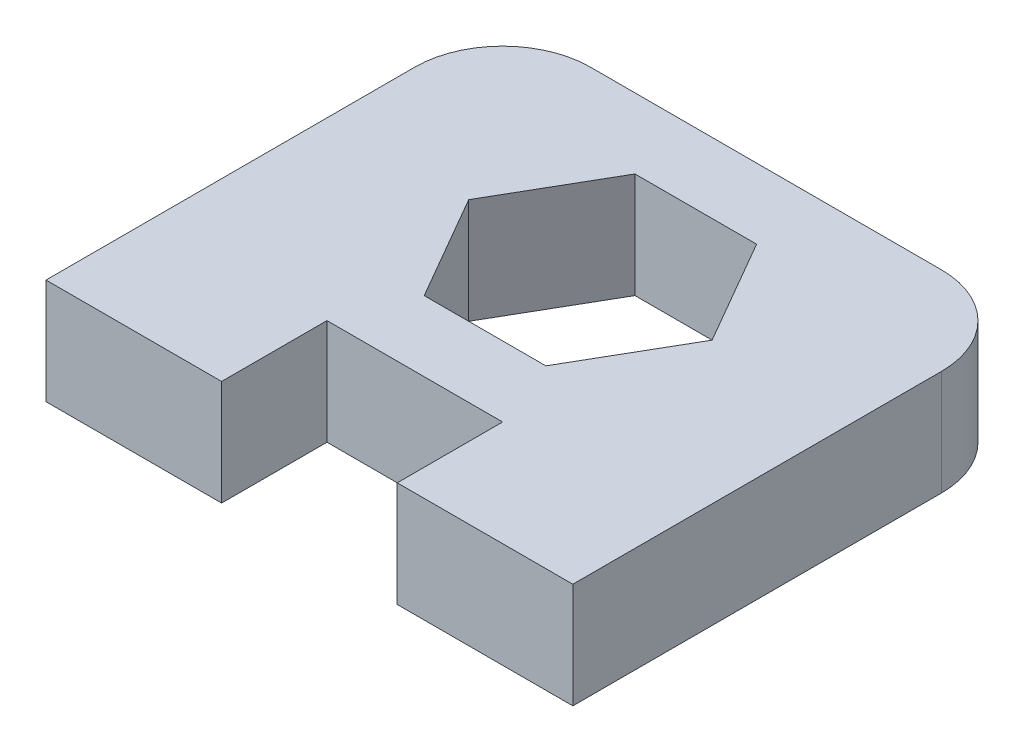
ISO-10303-21;
HEADER;
FILE_DESCRIPTION(('STEP AP214'),'2;1');
FILE_NAME('part.step','',(''),(''),'','','');
FILE_SCHEMA(('AUTOMOTIVE_DESIGN { 1 0 10303 214 1 1 1 1 }'));
ENDSEC;
DATA;
#1=APPLICATION_CONTEXT('core data for automotive mechanical design processes');
#2=APPLICATION_PROTOCOL_DEFINITION('international standard','automotive_design',2000,#1);
#3=PRODUCT_CONTEXT('',#1,'mechanical');
#4=PRODUCT('Part','Part','',(#3));
#5=PRODUCT_RELATED_PRODUCT_CATEGORY('part','',(#4));
#6=PRODUCT_DEFINITION_FORMATION('','',#4);
#7=PRODUCT_DEFINITION_CONTEXT('part definition',#1,'design');
#8=PRODUCT_DEFINITION('design','',#6,#7);
#9=PRODUCT_DEFINITION_SHAPE('','',#8);
#10=(LENGTH_UNIT() NAMED_UNIT(*) SI_UNIT(.MILLI.,.METRE.));
#11=(NAMED_UNIT(*) PLANE_ANGLE_UNIT() SI_UNIT($,.RADIAN.));
#12=(NAMED_UNIT(*) SI_UNIT($,.STERADIAN.) SOLID_ANGLE_UNIT());
#13=UNCERTAINTY_MEASURE_WITH_UNIT(LENGTH_MEASURE(1.E-05),#10,'distance_accuracy_value','');
#14=(GEOMETRIC_REPRESENTATION_CONTEXT(3) GLOBAL_UNCERTAINTY_ASSIGNED_CONTEXT((#13)) GLOBAL_UNIT_ASSIGNED_CONTEXT((#10,
#11,#12)) REPRESENTATION_CONTEXT('',''));
#15=CARTESIAN_POINT('',(0.,0.,0.));
#16=DIRECTION('',(0.,0.,1.));
#17=DIRECTION('',(1.,0.,0.));
#18=AXIS2_PLACEMENT_3D('',#15,#16,#17);
#19=CARTESIAN_POINT('',(2.5,3.,-10.5));
#20=DIRECTION('',(0.,-1.,0.));
#21=DIRECTION('',(0.,0.,-1.));
#22=AXIS2_PLACEMENT_3D('',#19,#20,#21);
#23=PLANE('',#22);
#24=DIRECTION('',(1.,0.,0.));
#25=VECTOR('',#24,1.);
#26=CARTESIAN_POINT('',(5.,3.,0.));
#27=LINE('',#26,#25);
#28=CARTESIAN_POINT('',(0.,3.,0.));
#29=VERTEX_POINT('',#28);
#30=CARTESIAN_POINT('',(5.,3.,0.));
#31=VERTEX_POINT('',#30);
#32=EDGE_CURVE('E197',#29,#31,#27,.T.);
#33=ORIENTED_EDGE('',*,*,#32,.T.);
#34=DIRECTION('',(0.,0.,-1.));
#35=VECTOR('',#34,1.);
#36=CARTESIAN_POINT('',(5.,3.,-3.));
#37=LINE('',#36,#35);
#38=CARTESIAN_POINT('',(5.,3.,-3.));
#39=VERTEX_POINT('',#38);
#40=EDGE_CURVE('E200',#31,#39,#37,.T.);
#41=ORIENTED_EDGE('',*,*,#40,.T.);
#42=DIRECTION('',(1.,0.,0.));
#43=VECTOR('',#42,1.);
#44=CARTESIAN_POINT('',(10.,3.,-3.));
#45=LINE('',#44,#43);
#46=CARTESIAN_POINT('',(10.,3.,-3.));
#47=VERTEX_POINT('',#46);
#48=EDGE_CURVE('E203',#39,#47,#45,.T.);
#49=ORIENTED_EDGE('',*,*,#48,.T.);
#50=DIRECTION('',(0.,0.,1.));
#51=VECTOR('',#50,1.);
#52=CARTESIAN_POINT('',(10.,3.,0.));
#53=LINE('',#52,#51);
#54=CARTESIAN_POINT('',(10.,3.,0.));
#55=VERTEX_POINT('',#54);
#56=EDGE_CURVE('E205',#47,#55,#53,.T.);
#57=ORIENTED_EDGE('',*,*,#56,.T.);
#58=DIRECTION('',(1.,0.,0.));
#59=VECTOR('',#58,1.);
#60=CARTESIAN_POINT('',(15.,3.,0.));
#61=LINE('',#60,#59);
#62=CARTESIAN_POINT('',(15.,3.,0.));
#63=VERTEX_POINT('',#62);
#64=EDGE_CURVE('E207',#55,#63,#61,.T.);
#65=ORIENTED_EDGE('',*,*,#64,.T.);
#66=DIRECTION('',(0.,0.,-1.));
#67=VECTOR('',#66,1.);
#68=CARTESIAN_POINT('',(15.,3.,-10.5));
#69=LINE('',#68,#67);
#70=CARTESIAN_POINT('',(15.,3.,-10.5));
#71=VERTEX_POINT('',#70);
#72=EDGE_CURVE('E209',#63,#71,#69,.T.);
#73=ORIENTED_EDGE('',*,*,#72,.T.);
#74=CARTESIAN_POINT('',(12.5,3.,-10.5));
#75=DIRECTION('',(0.,1.,0.));
#76=DIRECTION('',(0.,0.,-1.));
#77=AXIS2_PLACEMENT_3D('',#74,#75,#76);
#78=CIRCLE('',#77,2.5);
#79=CARTESIAN_POINT('',(12.5,3.,-13.));
#80=VERTEX_POINT('',#79);
#81=EDGE_CURVE('E211',#71,#80,#78,.T.);
#82=ORIENTED_EDGE('',*,*,#81,.T.);
#83=DIRECTION('',(-1.,0.,0.));
#84=VECTOR('',#83,1.);
#85=CARTESIAN_POINT('',(2.50000000000002,3.,-13.));
#86=LINE('',#85,#84);
#87=CARTESIAN_POINT('',(2.5,3.,-13.));
#88=VERTEX_POINT('',#87);
#89=EDGE_CURVE('E213',#80,#88,#86,.T.);
#90=ORIENTED_EDGE('',*,*,#89,.T.);
#91=CARTESIAN_POINT('',(2.5,3.,-10.5));
#92=DIRECTION('',(0.,1.,0.));
#93=DIRECTION('',(0.,0.,-1.));
#94=AXIS2_PLACEMENT_3D('',#91,#92,#93);
#95=CIRCLE('',#94,2.5);
#96=CARTESIAN_POINT('',(0.,3.,-10.5));
#97=VERTEX_POINT('',#96);
#98=EDGE_CURVE('E215',#88,#97,#95,.T.);
#99=ORIENTED_EDGE('',*,*,#98,.T.);
#100=DIRECTION('',(0.,0.,1.));
#101=VECTOR('',#100,1.);
#102=CARTESIAN_POINT('',(0.,3.,0.));
#103=LINE('',#102,#101);
#104=EDGE_CURVE('E217',#97,#29,#103,.T.);
#105=ORIENTED_EDGE('',*,*,#104,.T.);
#106=EDGE_LOOP('',(#33,#41,#49,#57,#65,#73,#82,#90,#99,#105));
#107=FACE_BOUND('',#106,.T.);
#108=DIRECTION('',(0.5,0.,0.866025403784439));
#109=VECTOR('',#108,1.);
#110=CARTESIAN_POINT('',(4.03589838486225,3.,-8.));
#111=LINE('',#110,#109);
#112=CARTESIAN_POINT('',(4.03589838486225,3.,-8.));
#113=VERTEX_POINT('',#112);
#114=CARTESIAN_POINT('',(5.76794919243112,3.,-5.00000000000001));
#115=VERTEX_POINT('',#114);
#116=EDGE_CURVE('E146',#113,#115,#111,.T.);
#117=ORIENTED_EDGE('',*,*,#116,.F.);
#118=DIRECTION('',(-0.500000000000001,0.,0.866025403784438));
#119=VECTOR('',#118,1.);
#120=CARTESIAN_POINT('',(5.76794919243112,3.,-11.));
#121=LINE('',#120,#119);
#122=CARTESIAN_POINT('',(5.76794919243112,3.,-11.));
#123=VERTEX_POINT('',#122);
#124=EDGE_CURVE('E175',#123,#113,#121,.T.);
#125=ORIENTED_EDGE('',*,*,#124,.F.);
#126=DIRECTION('',(-1.,0.,0.));
#127=VECTOR('',#126,1.);
#128=CARTESIAN_POINT('',(9.23205080756888,3.,-11.));
#129=LINE('',#128,#127);
#130=CARTESIAN_POINT('',(9.23205080756888,3.,-11.));
#131=VERTEX_POINT('',#130);
#132=EDGE_CURVE('E173',#131,#123,#129,.T.);
#133=ORIENTED_EDGE('',*,*,#132,.F.);
#134=DIRECTION('',(-0.5,0.,-0.866025403784439));
#135=VECTOR('',#134,1.);
#136=CARTESIAN_POINT('',(10.9641016151378,3.,-8.));
#137=LINE('',#136,#135);
#138=CARTESIAN_POINT('',(10.9641016151378,3.,-8.));
#139=VERTEX_POINT('',#138);
#140=EDGE_CURVE('E169',#139,#131,#137,.T.);
#141=ORIENTED_EDGE('',*,*,#140,.F.);
#142=DIRECTION('',(0.5,0.,-0.866025403784439));
#143=VECTOR('',#142,1.);
#144=CARTESIAN_POINT('',(9.23205080756888,3.,-5.00000000000001));
#145=LINE('',#144,#143);
#146=CARTESIAN_POINT('',(9.23205080756888,3.,-5.00000000000001));
#147=VERTEX_POINT('',#146);
#148=EDGE_CURVE('E167',#147,#139,#145,.T.);
#149=ORIENTED_EDGE('',*,*,#148,.F.);
#150=DIRECTION('',(1.,0.,0.));
#151=VECTOR('',#150,1.);
#152=CARTESIAN_POINT('',(5.76794919243112,3.,-5.00000000000001));
#153=LINE('',#152,#151);
#154=EDGE_CURVE('E154',#115,#147,#153,.T.);
#155=ORIENTED_EDGE('',*,*,#154,.F.);
#156=EDGE_LOOP('',(#117,#125,#133,#141,#149,#155));
#157=FACE_BOUND('',#156,.T.);
#158=ADVANCED_FACE('F33',(#107,#157),#23,.F.);
#159=CARTESIAN_POINT('',(2.5,0.,-10.5));
#160=DIRECTION('',(0.,-1.,0.));
#161=DIRECTION('',(0.,0.,-1.));
#162=AXIS2_PLACEMENT_3D('',#159,#160,#161);
#163=PLANE('',#162);
#164=DIRECTION('',(1.,0.,0.));
#165=VECTOR('',#164,1.);
#166=CARTESIAN_POINT('',(5.,0.,0.));
#167=LINE('',#166,#165);
#168=CARTESIAN_POINT('',(0.,0.,0.));
#169=VERTEX_POINT('',#168);
#170=CARTESIAN_POINT('',(5.,0.,0.));
#171=VERTEX_POINT('',#170);
#172=EDGE_CURVE('E162',#169,#171,#167,.T.);
#173=ORIENTED_EDGE('',*,*,#172,.F.);
#174=DIRECTION('',(0.,0.,1.));
#175=VECTOR('',#174,1.);
#176=CARTESIAN_POINT('',(0.,0.,0.));
#177=LINE('',#176,#175);
#178=CARTESIAN_POINT('',(0.,0.,-10.5));
#179=VERTEX_POINT('',#178);
#180=EDGE_CURVE('E201',#179,#169,#177,.T.);
#181=ORIENTED_EDGE('',*,*,#180,.F.);
#182=CARTESIAN_POINT('',(2.5,0.,-10.5));
#183=DIRECTION('',(0.,1.,0.));
#184=DIRECTION('',(0.,0.,-1.));
#185=AXIS2_PLACEMENT_3D('',#182,#183,#184);
#186=CIRCLE('',#185,2.5);
#187=CARTESIAN_POINT('',(2.5,0.,-13.));
#188=VERTEX_POINT('',#187);
#189=EDGE_CURVE('E236',#188,#179,#186,.T.);
#190=ORIENTED_EDGE('',*,*,#189,.F.);
#191=DIRECTION('',(-1.,0.,0.));
#192=VECTOR('',#191,1.);
#193=CARTESIAN_POINT('',(2.50000000000002,0.,-13.));
#194=LINE('',#193,#192);
#195=CARTESIAN_POINT('',(12.5,0.,-13.));
#196=VERTEX_POINT('',#195);
#197=EDGE_CURVE('E234',#196,#188,#194,.T.);
#198=ORIENTED_EDGE('',*,*,#197,.F.);
#199=CARTESIAN_POINT('',(12.5,0.,-10.5));
#200=DIRECTION('',(0.,1.,0.));
#201=DIRECTION('',(0.,0.,-1.));
#202=AXIS2_PLACEMENT_3D('',#199,#200,#201);
#203=CIRCLE('',#202,2.5);
#204=CARTESIAN_POINT('',(15.,0.,-10.5));
#205=VERTEX_POINT('',#204);
#206=EDGE_CURVE('E232',#205,#196,#203,.T.);
#207=ORIENTED_EDGE('',*,*,#206,.F.);
#208=DIRECTION('',(0.,0.,-1.));
#209=VECTOR('',#208,1.);
#210=CARTESIAN_POINT('',(15.,0.,-10.5));
#211=LINE('',#210,#209);
#212=CARTESIAN_POINT('',(15.,0.,0.));
#213=VERTEX_POINT('',#212);
#214=EDGE_CURVE('E230',#213,#205,#211,.T.);
#215=ORIENTED_EDGE('',*,*,#214,.F.);
#216=DIRECTION('',(1.,0.,0.));
#217=VECTOR('',#216,1.);
#218=CARTESIAN_POINT('',(15.,0.,0.));
#219=LINE('',#218,#217);
#220=CARTESIAN_POINT('',(10.,0.,0.));
#221=VERTEX_POINT('',#220);
#222=EDGE_CURVE('E228',#221,#213,#219,.T.);
#223=ORIENTED_EDGE('',*,*,#222,.F.);
#224=DIRECTION('',(0.,0.,1.));
#225=VECTOR('',#224,1.);
#226=CARTESIAN_POINT('',(10.,0.,0.));
#227=LINE('',#226,#225);
#228=CARTESIAN_POINT('',(10.,0.,-3.));
#229=VERTEX_POINT('',#228);
#230=EDGE_CURVE('E226',#229,#221,#227,.T.);
#231=ORIENTED_EDGE('',*,*,#230,.F.);
#232=DIRECTION('',(1.,0.,0.));
#233=VECTOR('',#232,1.);
#234=CARTESIAN_POINT('',(10.,0.,-3.));
#235=LINE('',#234,#233);
#236=CARTESIAN_POINT('',(5.,0.,-3.));
#237=VERTEX_POINT('',#236);
#238=EDGE_CURVE('E224',#237,#229,#235,.T.);
#239=ORIENTED_EDGE('',*,*,#238,.F.);
#240=DIRECTION('',(0.,0.,-1.));
#241=VECTOR('',#240,1.);
#242=CARTESIAN_POINT('',(5.,0.,-3.));
#243=LINE('',#242,#241);
#244=EDGE_CURVE('E222',#171,#237,#243,.T.);
#245=ORIENTED_EDGE('',*,*,#244,.F.);
#246=EDGE_LOOP('',(#173,#181,#190,#198,#207,#215,#223,#231,#239,#245));
#247=FACE_BOUND('',#246,.T.);
#248=DIRECTION('',(-0.500000000000001,0.,0.866025403784438));
#249=VECTOR('',#248,1.);
#250=CARTESIAN_POINT('',(5.76794919243112,0.,-11.));
#251=LINE('',#250,#249);
#252=CARTESIAN_POINT('',(5.76794919243112,0.,-11.));
#253=VERTEX_POINT('',#252);
#254=CARTESIAN_POINT('',(4.03589838486225,0.,-8.));
#255=VERTEX_POINT('',#254);
#256=EDGE_CURVE('E155',#253,#255,#251,.T.);
#257=ORIENTED_EDGE('',*,*,#256,.T.);
#258=DIRECTION('',(0.5,0.,0.866025403784439));
#259=VECTOR('',#258,1.);
#260=CARTESIAN_POINT('',(4.03589838486225,0.,-8.));
#261=LINE('',#260,#259);
#262=CARTESIAN_POINT('',(5.76794919243112,0.,-5.00000000000001));
#263=VERTEX_POINT('',#262);
#264=EDGE_CURVE('E56',#255,#263,#261,.T.);
#265=ORIENTED_EDGE('',*,*,#264,.T.);
#266=DIRECTION('',(1.,0.,0.));
#267=VECTOR('',#266,1.);
#268=CARTESIAN_POINT('',(5.76794919243112,0.,-5.00000000000001));
#269=LINE('',#268,#267);
#270=CARTESIAN_POINT('',(9.23205080756888,0.,-5.00000000000001));
#271=VERTEX_POINT('',#270);
#272=EDGE_CURVE('E161',#263,#271,#269,.T.);
#273=ORIENTED_EDGE('',*,*,#272,.T.);
#274=DIRECTION('',(0.5,0.,-0.866025403784439));
#275=VECTOR('',#274,1.);
#276=CARTESIAN_POINT('',(9.23205080756888,0.,-5.00000000000001));
#277=LINE('',#276,#275);
#278=CARTESIAN_POINT('',(10.9641016151378,0.,-8.));
#279=VERTEX_POINT('',#278);
#280=EDGE_CURVE('E179',#271,#279,#277,.T.);
#281=ORIENTED_EDGE('',*,*,#280,.T.);
#282=DIRECTION('',(-0.5,0.,-0.866025403784439));
#283=VECTOR('',#282,1.);
#284=CARTESIAN_POINT('',(10.9641016151378,0.,-8.));
#285=LINE('',#284,#283);
#286=CARTESIAN_POINT('',(9.23205080756888,0.,-11.));
#287=VERTEX_POINT('',#286);
#288=EDGE_CURVE('E182',#279,#287,#285,.T.);
#289=ORIENTED_EDGE('',*,*,#288,.T.);
#290=DIRECTION('',(-1.,0.,0.));
#291=VECTOR('',#290,1.);
#292=CARTESIAN_POINT('',(9.23205080756888,0.,-11.));
#293=LINE('',#292,#291);
#294=EDGE_CURVE('E185',#287,#253,#293,.T.);
#295=ORIENTED_EDGE('',*,*,#294,.T.);
#296=EDGE_LOOP('',(#257,#265,#273,#281,#289,#295));
#297=FACE_BOUND('',#296,.T.);
#298=ADVANCED_FACE('F272',(#247,#297),#163,.T.);
#299=CARTESIAN_POINT('',(5.,3.,0.));
#300=DIRECTION('',(0.,0.,-1.));
#301=DIRECTION('',(-1.,0.,0.));
#302=AXIS2_PLACEMENT_3D('',#299,#300,#301);
#303=PLANE('',#302);
#304=ORIENTED_EDGE('',*,*,#172,.T.);
#305=DIRECTION('',(0.,-1.,0.));
#306=VECTOR('',#305,1.);
#307=CARTESIAN_POINT('',(5.,3.,0.));
#308=LINE('',#307,#306);
#309=EDGE_CURVE('E11',#31,#171,#308,.T.);
#310=ORIENTED_EDGE('',*,*,#309,.F.);
#311=ORIENTED_EDGE('',*,*,#32,.F.);
#312=DIRECTION('',(0.,-1.,0.));
#313=VECTOR('',#312,1.);
#314=CARTESIAN_POINT('',(0.,3.,0.));
#315=LINE('',#314,#313);
#316=EDGE_CURVE('E219',#29,#169,#315,.T.);
#317=ORIENTED_EDGE('',*,*,#316,.T.);
#318=EDGE_LOOP('',(#304,#310,#311,#317));
#319=FACE_BOUND('',#318,.T.);
#320=ADVANCED_FACE('F35',(#319),#303,.F.);
#321=CARTESIAN_POINT('',(5.,3.,-3.));
#322=DIRECTION('',(-1.,0.,0.));
#323=DIRECTION('',(0.,0.,1.));
#324=AXIS2_PLACEMENT_3D('',#321,#322,#323);
#325=PLANE('',#324);
#326=ORIENTED_EDGE('',*,*,#244,.T.);
#327=DIRECTION('',(0.,-1.,0.));
#328=VECTOR('',#327,1.);
#329=CARTESIAN_POINT('',(5.,3.,-3.));
#330=LINE('',#329,#328);
#331=EDGE_CURVE('E41',#39,#237,#330,.T.);
#332=ORIENTED_EDGE('',*,*,#331,.F.);
#333=ORIENTED_EDGE('',*,*,#40,.F.);
#334=ORIENTED_EDGE('',*,*,#309,.T.);
#335=EDGE_LOOP('',(#326,#332,#333,#334));
#336=FACE_BOUND('',#335,.T.);
#337=ADVANCED_FACE('F289',(#336),#325,.F.);
#338=CARTESIAN_POINT('',(10.,3.,-3.));
#339=DIRECTION('',(0.,0.,-1.));
#340=DIRECTION('',(-1.,0.,0.));
#341=AXIS2_PLACEMENT_3D('',#338,#339,#340);
#342=PLANE('',#341);
#343=ORIENTED_EDGE('',*,*,#238,.T.);
#344=DIRECTION('',(0.,-1.,0.));
#345=VECTOR('',#344,1.);
#346=CARTESIAN_POINT('',(10.,3.,-3.));
#347=LINE('',#346,#345);
#348=EDGE_CURVE('E259',#47,#229,#347,.T.);
#349=ORIENTED_EDGE('',*,*,#348,.F.);
#350=ORIENTED_EDGE('',*,*,#48,.F.);
#351=ORIENTED_EDGE('',*,*,#331,.T.);
#352=EDGE_LOOP('',(#343,#349,#350,#351));
#353=FACE_BOUND('',#352,.T.);
#354=ADVANCED_FACE('F266',(#353),#342,.F.);
#355=CARTESIAN_POINT('',(10.,3.,0.));
#356=DIRECTION('',(1.,0.,0.));
#357=DIRECTION('',(0.,0.,-1.));
#358=AXIS2_PLACEMENT_3D('',#355,#356,#357);
#359=PLANE('',#358);
#360=ORIENTED_EDGE('',*,*,#230,.T.);
#361=DIRECTION('',(0.,-1.,0.));
#362=VECTOR('',#361,1.);
#363=CARTESIAN_POINT('',(10.,3.,0.));
#364=LINE('',#363,#362);
#365=EDGE_CURVE('E256',#55,#221,#364,.T.);
#366=ORIENTED_EDGE('',*,*,#365,.F.);
#367=ORIENTED_EDGE('',*,*,#56,.F.);
#368=ORIENTED_EDGE('',*,*,#348,.T.);
#369=EDGE_LOOP('',(#360,#366,#367,#368));
#370=FACE_BOUND('',#369,.T.);
#371=ADVANCED_FACE('F278',(#370),#359,.F.);
#372=CARTESIAN_POINT('',(15.,3.,0.));
#373=DIRECTION('',(0.,0.,-1.));
#374=DIRECTION('',(-1.,0.,0.));
#375=AXIS2_PLACEMENT_3D('',#372,#373,#374);
#376=PLANE('',#375);
#377=ORIENTED_EDGE('',*,*,#222,.T.);
#378=DIRECTION('',(0.,-1.,0.));
#379=VECTOR('',#378,1.);
#380=CARTESIAN_POINT('',(15.,3.,0.));
#381=LINE('',#380,#379);
#382=EDGE_CURVE('E253',#63,#213,#381,.T.);
#383=ORIENTED_EDGE('',*,*,#382,.F.);
#384=ORIENTED_EDGE('',*,*,#64,.F.);
#385=ORIENTED_EDGE('',*,*,#365,.T.);
#386=EDGE_LOOP('',(#377,#383,#384,#385));
#387=FACE_BOUND('',#386,.T.);
#388=ADVANCED_FACE('F282',(#387),#376,.F.);
#389=CARTESIAN_POINT('',(15.,3.,-10.5));
#390=DIRECTION('',(-1.,0.,0.));
#391=DIRECTION('',(0.,0.,1.));
#392=AXIS2_PLACEMENT_3D('',#389,#390,#391);
#393=PLANE('',#392);
#394=ORIENTED_EDGE('',*,*,#214,.T.);
#395=DIRECTION('',(0.,-1.,0.));
#396=VECTOR('',#395,1.);
#397=CARTESIAN_POINT('',(15.,3.,-10.5));
#398=LINE('',#397,#396);
#399=EDGE_CURVE('E250',#71,#205,#398,.T.);
#400=ORIENTED_EDGE('',*,*,#399,.F.);
#401=ORIENTED_EDGE('',*,*,#72,.F.);
#402=ORIENTED_EDGE('',*,*,#382,.T.);
#403=EDGE_LOOP('',(#394,#400,#401,#402));
#404=FACE_BOUND('',#403,.T.);
#405=ADVANCED_FACE('F312',(#404),#393,.F.);
#406=CARTESIAN_POINT('',(12.5,3.,-10.5));
#407=DIRECTION('',(0.,-1.,0.));
#408=DIRECTION('',(0.,0.,-1.));
#409=AXIS2_PLACEMENT_3D('',#406,#407,#408);
#410=CYLINDRICAL_SURFACE('',#409,2.5);
#411=ORIENTED_EDGE('',*,*,#206,.T.);
#412=DIRECTION('',(0.,-1.,0.));
#413=VECTOR('',#412,1.);
#414=CARTESIAN_POINT('',(12.5,3.,-13.));
#415=LINE('',#414,#413);
#416=EDGE_CURVE('E247',#80,#196,#415,.T.);
#417=ORIENTED_EDGE('',*,*,#416,.F.);
#418=ORIENTED_EDGE('',*,*,#81,.F.);
#419=ORIENTED_EDGE('',*,*,#399,.T.);
#420=EDGE_LOOP('',(#411,#417,#418,#419));
#421=FACE_BOUND('',#420,.T.);
#422=ADVANCED_FACE('F309',(#421),#410,.T.);
#423=CARTESIAN_POINT('',(2.50000000000002,3.,-13.));
#424=DIRECTION('',(0.,0.,1.));
#425=DIRECTION('',(1.,0.,0.));
#426=AXIS2_PLACEMENT_3D('',#423,#424,#425);
#427=PLANE('',#426);
#428=ORIENTED_EDGE('',*,*,#197,.T.);
#429=DIRECTION('',(0.,-1.,0.));
#430=VECTOR('',#429,1.);
#431=CARTESIAN_POINT('',(2.5,3.,-13.));
#432=LINE('',#431,#430);
#433=EDGE_CURVE('E244',#88,#188,#432,.T.);
#434=ORIENTED_EDGE('',*,*,#433,.F.);
#435=ORIENTED_EDGE('',*,*,#89,.F.);
#436=ORIENTED_EDGE('',*,*,#416,.T.);
#437=EDGE_LOOP('',(#428,#434,#435,#436));
#438=FACE_BOUND('',#437,.T.);
#439=ADVANCED_FACE('F305',(#438),#427,.F.);
#440=CARTESIAN_POINT('',(2.5,3.,-10.5));
#441=DIRECTION('',(0.,-1.,0.));
#442=DIRECTION('',(0.,0.,-1.));
#443=AXIS2_PLACEMENT_3D('',#440,#441,#442);
#444=CYLINDRICAL_SURFACE('',#443,2.5);
#445=ORIENTED_EDGE('',*,*,#189,.T.);
#446=DIRECTION('',(0.,-1.,0.));
#447=VECTOR('',#446,1.);
#448=CARTESIAN_POINT('',(0.,3.,-10.5));
#449=LINE('',#448,#447);
#450=EDGE_CURVE('E241',#97,#179,#449,.T.);
#451=ORIENTED_EDGE('',*,*,#450,.F.);
#452=ORIENTED_EDGE('',*,*,#98,.F.);
#453=ORIENTED_EDGE('',*,*,#433,.T.);
#454=EDGE_LOOP('',(#445,#451,#452,#453));
#455=FACE_BOUND('',#454,.T.);
#456=ADVANCED_FACE('F301',(#455),#444,.T.);
#457=CARTESIAN_POINT('',(0.,3.,0.));
#458=DIRECTION('',(1.,0.,0.));
#459=DIRECTION('',(0.,0.,-1.));
#460=AXIS2_PLACEMENT_3D('',#457,#458,#459);
#461=PLANE('',#460);
#462=ORIENTED_EDGE('',*,*,#180,.T.);
#463=ORIENTED_EDGE('',*,*,#316,.F.);
#464=ORIENTED_EDGE('',*,*,#104,.F.);
#465=ORIENTED_EDGE('',*,*,#450,.T.);
#466=EDGE_LOOP('',(#462,#463,#464,#465));
#467=FACE_BOUND('',#466,.T.);
#468=ADVANCED_FACE('F296',(#467),#461,.F.);
#469=CARTESIAN_POINT('',(4.03589838486225,3.,-8.));
#470=DIRECTION('',(0.866025403784439,0.,-0.5));
#471=DIRECTION('',(-0.5,0.,-0.866025403784439));
#472=AXIS2_PLACEMENT_3D('',#469,#470,#471);
#473=PLANE('',#472);
#474=ORIENTED_EDGE('',*,*,#264,.F.);
#475=DIRECTION('',(0.,-1.,0.));
#476=VECTOR('',#475,1.);
#477=CARTESIAN_POINT('',(4.03589838486225,3.,-8.));
#478=LINE('',#477,#476);
#479=EDGE_CURVE('E150',#113,#255,#478,.T.);
#480=ORIENTED_EDGE('',*,*,#479,.F.);
#481=ORIENTED_EDGE('',*,*,#116,.T.);
#482=DIRECTION('',(0.,-1.,0.));
#483=VECTOR('',#482,1.);
#484=CARTESIAN_POINT('',(5.76794919243112,3.,-5.00000000000001));
#485=LINE('',#484,#483);
#486=EDGE_CURVE('E149',#115,#263,#485,.T.);
#487=ORIENTED_EDGE('',*,*,#486,.T.);
#488=EDGE_LOOP('',(#474,#480,#481,#487));
#489=FACE_BOUND('',#488,.T.);
#490=ADVANCED_FACE('F148',(#489),#473,.T.);
#491=CARTESIAN_POINT('',(5.76794919243112,3.,-5.00000000000001));
#492=DIRECTION('',(0.,0.,-1.));
#493=DIRECTION('',(-1.,0.,0.));
#494=AXIS2_PLACEMENT_3D('',#491,#492,#493);
#495=PLANE('',#494);
#496=ORIENTED_EDGE('',*,*,#272,.F.);
#497=ORIENTED_EDGE('',*,*,#486,.F.);
#498=ORIENTED_EDGE('',*,*,#154,.T.);
#499=DIRECTION('',(0.,-1.,0.));
#500=VECTOR('',#499,1.);
#501=CARTESIAN_POINT('',(9.23205080756888,3.,-5.00000000000001));
#502=LINE('',#501,#500);
#503=EDGE_CURVE('E163',#147,#271,#502,.T.);
#504=ORIENTED_EDGE('',*,*,#503,.T.);
#505=EDGE_LOOP('',(#496,#497,#498,#504));
#506=FACE_BOUND('',#505,.T.);
#507=ADVANCED_FACE('F158',(#506),#495,.T.);
#508=CARTESIAN_POINT('',(9.23205080756888,3.,-5.00000000000001));
#509=DIRECTION('',(-0.866025403784439,0.,-0.5));
#510=DIRECTION('',(-0.5,0.,0.866025403784439));
#511=AXIS2_PLACEMENT_3D('',#508,#509,#510);
#512=PLANE('',#511);
#513=ORIENTED_EDGE('',*,*,#280,.F.);
#514=ORIENTED_EDGE('',*,*,#503,.F.);
#515=ORIENTED_EDGE('',*,*,#148,.T.);
#516=DIRECTION('',(0.,-1.,0.));
#517=VECTOR('',#516,1.);
#518=CARTESIAN_POINT('',(10.9641016151378,3.,-8.));
#519=LINE('',#518,#517);
#520=EDGE_CURVE('E194',#139,#279,#519,.T.);
#521=ORIENTED_EDGE('',*,*,#520,.T.);
#522=EDGE_LOOP('',(#513,#514,#515,#521));
#523=FACE_BOUND('',#522,.T.);
#524=ADVANCED_FACE('F358',(#523),#512,.T.);
#525=CARTESIAN_POINT('',(10.9641016151378,3.,-8.));
#526=DIRECTION('',(-0.866025403784439,0.,0.5));
#527=DIRECTION('',(0.5,0.,0.866025403784439));
#528=AXIS2_PLACEMENT_3D('',#525,#526,#527);
#529=PLANE('',#528);
#530=ORIENTED_EDGE('',*,*,#288,.F.);
#531=ORIENTED_EDGE('',*,*,#520,.F.);
#532=ORIENTED_EDGE('',*,*,#140,.T.);
#533=DIRECTION('',(0.,-1.,0.));
#534=VECTOR('',#533,1.);
#535=CARTESIAN_POINT('',(9.23205080756888,3.,-11.));
#536=LINE('',#535,#534);
#537=EDGE_CURVE('E192',#131,#287,#536,.T.);
#538=ORIENTED_EDGE('',*,*,#537,.T.);
#539=EDGE_LOOP('',(#530,#531,#532,#538));
#540=FACE_BOUND('',#539,.T.);
#541=ADVANCED_FACE('F364',(#540),#529,.T.);
#542=CARTESIAN_POINT('',(9.23205080756888,3.,-11.));
#543=DIRECTION('',(0.,0.,1.));
#544=DIRECTION('',(1.,0.,0.));
#545=AXIS2_PLACEMENT_3D('',#542,#543,#544);
#546=PLANE('',#545);
#547=ORIENTED_EDGE('',*,*,#294,.F.);
#548=ORIENTED_EDGE('',*,*,#537,.F.);
#549=ORIENTED_EDGE('',*,*,#132,.T.);
#550=DIRECTION('',(0.,-1.,0.));
#551=VECTOR('',#550,1.);
#552=CARTESIAN_POINT('',(5.76794919243112,3.,-11.));
#553=LINE('',#552,#551);
#554=EDGE_CURVE('E48',#123,#253,#553,.T.);
#555=ORIENTED_EDGE('',*,*,#554,.T.);
#556=EDGE_LOOP('',(#547,#548,#549,#555));
#557=FACE_BOUND('',#556,.T.);
#558=ADVANCED_FACE('F372',(#557),#546,.T.);
#559=CARTESIAN_POINT('',(5.76794919243112,3.,-11.));
#560=DIRECTION('',(0.866025403784438,0.,0.500000000000001));
#561=DIRECTION('',(0.500000000000001,0.,-0.866025403784438));
#562=AXIS2_PLACEMENT_3D('',#559,#560,#561);
#563=PLANE('',#562);
#564=ORIENTED_EDGE('',*,*,#256,.F.);
#565=ORIENTED_EDGE('',*,*,#554,.F.);
#566=ORIENTED_EDGE('',*,*,#124,.T.);
#567=ORIENTED_EDGE('',*,*,#479,.T.);
#568=EDGE_LOOP('',(#564,#565,#566,#567));
#569=FACE_BOUND('',#568,.T.);
#570=ADVANCED_FACE('F380',(#569),#563,.T.);
#571=CLOSED_SHELL('',(#158,#298,#320,#337,#354,#371,#388,#405,#422,#439,#456,#468,#490,#507,
#524,#541,#558,#570));
#572=MANIFOLD_SOLID_BREP('B2',#571);
#573=ADVANCED_BREP_SHAPE_REPRESENTATION('',(#18,#572),#14);
#574=SHAPE_DEFINITION_REPRESENTATION(#9,#573);
ENDSEC;
END-ISO-10303-21;
